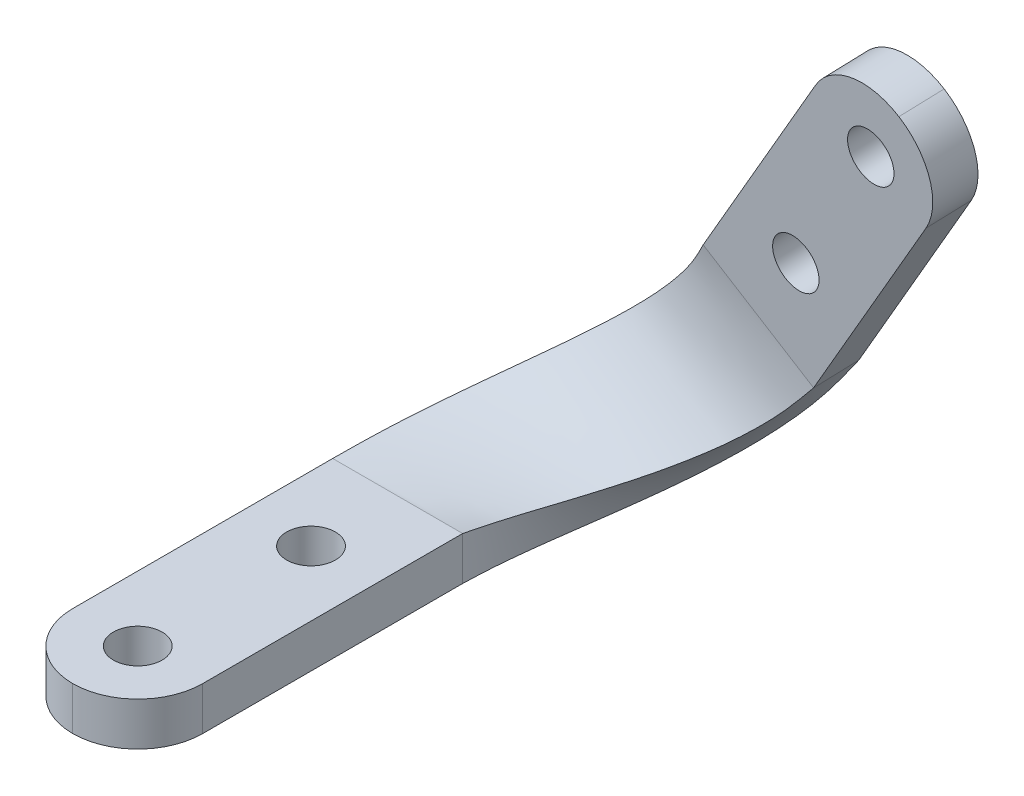
ISO-10303-21;
HEADER;
FILE_DESCRIPTION(('STEP AP214'),'2;1');
FILE_NAME('part.step','',(''),(''),'','','');
FILE_SCHEMA(('AUTOMOTIVE_DESIGN { 1 0 10303 214 1 1 1 1 }'));
ENDSEC;
DATA;
#1=APPLICATION_CONTEXT('core data for automotive mechanical design processes');
#2=APPLICATION_PROTOCOL_DEFINITION('international standard','automotive_design',2000,#1);
#3=PRODUCT_CONTEXT('',#1,'mechanical');
#4=PRODUCT('Part','Part','',(#3));
#5=PRODUCT_RELATED_PRODUCT_CATEGORY('part','',(#4));
#6=PRODUCT_DEFINITION_FORMATION('','',#4);
#7=PRODUCT_DEFINITION_CONTEXT('part definition',#1,'design');
#8=PRODUCT_DEFINITION('design','',#6,#7);
#9=PRODUCT_DEFINITION_SHAPE('','',#8);
#10=(LENGTH_UNIT() NAMED_UNIT(*) SI_UNIT(.MILLI.,.METRE.));
#11=(NAMED_UNIT(*) PLANE_ANGLE_UNIT() SI_UNIT($,.RADIAN.));
#12=(NAMED_UNIT(*) SI_UNIT($,.STERADIAN.) SOLID_ANGLE_UNIT());
#13=UNCERTAINTY_MEASURE_WITH_UNIT(LENGTH_MEASURE(1.E-05),#10,'distance_accuracy_value','');
#14=(GEOMETRIC_REPRESENTATION_CONTEXT(3) GLOBAL_UNCERTAINTY_ASSIGNED_CONTEXT((#13)) GLOBAL_UNIT_ASSIGNED_CONTEXT((#10,
#11,#12)) REPRESENTATION_CONTEXT('',''));
#15=CARTESIAN_POINT('',(0.,0.,0.));
#16=DIRECTION('',(0.,0.,1.));
#17=DIRECTION('',(1.,0.,0.));
#18=AXIS2_PLACEMENT_3D('',#15,#16,#17);
#19=CARTESIAN_POINT('',(87.6071870087429,121.992427648043,33.4995000851092));
#20=DIRECTION('',(-0.847822787226467,0.530276573500271,0.00181026416767009));
#21=DIRECTION('',(-0.530277442375515,-0.847824176411409,0.));
#22=AXIS2_PLACEMENT_3D('',#19,#20,#21);
#23=PLANE('',#22);
#24=DIRECTION('',(-0.528000453286406,-0.843857644069764,-0.0954976328208115));
#25=VECTOR('',#24,1.);
#26=CARTESIAN_POINT('',(87.6071870087429,121.992427648043,33.4995000851092));
#27=LINE('',#26,#25);
#28=CARTESIAN_POINT('',(54.0791582250561,68.4074672496127,27.4354004009877));
#29=VERTEX_POINT('',#28);
#30=CARTESIAN_POINT('',(33.9623409548441,36.2564910105547,23.7969405905148));
#31=VERTEX_POINT('',#30);
#32=EDGE_CURVE('E283',#29,#31,#27,.T.);
#33=ORIENTED_EDGE('',*,*,#32,.T.);
#34=CARTESIAN_POINT('',(34.2742056616566,36.7766886590877,17.4759727207099));
#35=CARTESIAN_POINT('',(33.9623409548441,36.2564910105547,23.7969405905148));
#36=B_SPLINE_CURVE_WITH_KNOTS('',1,(#34,#35),.UNSPECIFIED.,.F.,.F.,(2,2),(0.,1.),.UNSPECIFIED.);
#37=CARTESIAN_POINT('',(34.2742056616566,36.7766886590877,17.4759727207099));
#38=VERTEX_POINT('',#37);
#39=EDGE_CURVE('E337',#31,#38,#36,.F.);
#40=ORIENTED_EDGE('',*,*,#39,.T.);
#41=DIRECTION('',(-0.528000453286406,-0.843857644069764,-0.0954976328208115));
#42=VECTOR('',#41,1.);
#43=CARTESIAN_POINT('',(87.9190517155554,122.512625296576,27.1785322153044));
#44=LINE('',#43,#42);
#45=CARTESIAN_POINT('',(54.3910229318686,68.9276648981457,21.1144325311828));
#46=VERTEX_POINT('',#45);
#47=EDGE_CURVE('E407',#46,#38,#44,.T.);
#48=ORIENTED_EDGE('',*,*,#47,.F.);
#49=DIRECTION('',(0.049112552253933,0.0819208895327681,-0.995428010992892));
#50=VECTOR('',#49,1.);
#51=CARTESIAN_POINT('',(54.0791582250561,68.4074672496127,27.4354004009877));
#52=LINE('',#51,#50);
#53=EDGE_CURVE('E11',#29,#46,#52,.T.);
#54=ORIENTED_EDGE('',*,*,#53,.F.);
#55=EDGE_LOOP('',(#33,#40,#48,#54));
#56=FACE_BOUND('',#55,.T.);
#57=ADVANCED_FACE('F41',(#56),#23,.F.);
#58=CARTESIAN_POINT('',(-9.01110616876953,3.49029141699084,18.9801463756117));
#59=DIRECTION('',(0.847822787226467,-0.530276573500271,-0.00181026416767008));
#60=DIRECTION('',(0.530277442375514,0.847824176411408,0.));
#61=AXIS2_PLACEMENT_3D('',#58,#59,#60);
#62=PLANE('',#61);
#63=DIRECTION('',(0.528000453286406,0.843857644069764,0.0954976328208115));
#64=VECTOR('',#63,1.);
#65=CARTESIAN_POINT('',(-8.69924146195705,4.01048906552392,12.6591785058068));
#66=LINE('',#65,#64);
#67=CARTESIAN_POINT('',(18.1231815649923,46.8784573842679,17.510458253104));
#68=VERTEX_POINT('',#67);
#69=CARTESIAN_POINT('',(38.2399988352044,79.029433623326,21.148918063577));
#70=VERTEX_POINT('',#69);
#71=EDGE_CURVE('E290',#68,#70,#66,.T.);
#72=ORIENTED_EDGE('',*,*,#71,.F.);
#73=CARTESIAN_POINT('',(17.8113168581799,46.3582597357348,23.8314261229089));
#74=CARTESIAN_POINT('',(18.1231815649923,46.8784573842679,17.510458253104));
#75=B_SPLINE_CURVE_WITH_KNOTS('',1,(#73,#74),.UNSPECIFIED.,.F.,.F.,(2,2),(0.,1.),.UNSPECIFIED.);
#76=CARTESIAN_POINT('',(17.8113168581799,46.3582597357348,23.8314261229089));
#77=VERTEX_POINT('',#76);
#78=EDGE_CURVE('E434',#77,#68,#75,.T.);
#79=ORIENTED_EDGE('',*,*,#78,.F.);
#80=DIRECTION('',(0.528000453286406,0.843857644069764,0.0954976328208115));
#81=VECTOR('',#80,1.);
#82=CARTESIAN_POINT('',(-9.01110616876953,3.49029141699084,18.9801463756117));
#83=LINE('',#82,#81);
#84=CARTESIAN_POINT('',(37.928134128392,78.5092359747929,27.4698859333818));
#85=VERTEX_POINT('',#84);
#86=EDGE_CURVE('E301',#77,#85,#83,.T.);
#87=ORIENTED_EDGE('',*,*,#86,.T.);
#88=DIRECTION('',(0.049112552253933,0.0819208895327681,-0.995428010992892));
#89=VECTOR('',#88,1.);
#90=CARTESIAN_POINT('',(37.9281341283919,78.5092359747929,27.4698859333818));
#91=LINE('',#90,#89);
#92=EDGE_CURVE('E401',#70,#85,#91,.F.);
#93=ORIENTED_EDGE('',*,*,#92,.F.);
#94=EDGE_LOOP('',(#72,#79,#87,#93));
#95=FACE_BOUND('',#94,.T.);
#96=ADVANCED_FACE('F262',(#95),#62,.F.);
#97=CARTESIAN_POINT('',(-0.935594120437424,-1.56059294559923,18.9629036094146));
#98=DIRECTION('',(-0.049112552253933,-0.0819208895327681,0.995428010992892));
#99=DIRECTION('',(0.,0.996630694601877,0.0820198669675865));
#100=AXIS2_PLACEMENT_3D('',#97,#98,#99);
#101=PLANE('',#100);
#102=CARTESIAN_POINT('',(46.0036461767241,73.4583516122028,27.4526431671847));
#103=DIRECTION('',(0.049112552253933,0.0819208895327678,-0.995428010992892));
#104=DIRECTION('',(0.,0.996630694601877,0.0820198669675863));
#105=AXIS2_PLACEMENT_3D('',#102,#103,#104);
#106=CIRCLE('',#105,3.57124);
#107=CARTESIAN_POINT('',(46.0036461767241,77.0175590139928,27.7455557968941));
#108=VERTEX_POINT('',#107);
#109=EDGE_CURVE('E383',#108,#108,#106,.T.);
#110=ORIENTED_EDGE('',*,*,#109,.T.);
#111=EDGE_LOOP('',(#110));
#112=FACE_BOUND('',#111,.T.);
#113=CARTESIAN_POINT('',(32.5924346632494,52.0243674528308,25.0270032935361));
#114=DIRECTION('',(0.049112552253933,0.0819208895327678,-0.995428010992892));
#115=DIRECTION('',(0.,0.996630694601877,0.0820198669675863));
#116=AXIS2_PLACEMENT_3D('',#113,#114,#115);
#117=CIRCLE('',#116,3.57124);
#118=CARTESIAN_POINT('',(32.5924346632494,55.5835748546208,25.3199159232454));
#119=VERTEX_POINT('',#118);
#120=EDGE_CURVE('E393',#119,#119,#117,.T.);
#121=ORIENTED_EDGE('',*,*,#120,.T.);
#122=EDGE_LOOP('',(#121));
#123=FACE_BOUND('',#122,.T.);
#124=ORIENTED_EDGE('',*,*,#86,.F.);
#125=CARTESIAN_POINT('',(33.9623409548441,36.2564910105547,23.7969405905148));
#126=CARTESIAN_POINT('',(17.8113168581799,46.3582597357348,23.8314261229089));
#127=B_SPLINE_CURVE_WITH_KNOTS('',1,(#125,#126),.UNSPECIFIED.,.F.,.F.,(2,2),(0.,1.),.UNSPECIFIED.);
#128=EDGE_CURVE('E154',#31,#77,#127,.T.);
#129=ORIENTED_EDGE('',*,*,#128,.F.);
#130=ORIENTED_EDGE('',*,*,#32,.F.);
#131=CARTESIAN_POINT('',(46.003646176724,73.4583516122028,27.4526431671847));
#132=DIRECTION('',(0.049112552253933,0.0819208895327681,-0.995428010992892));
#133=DIRECTION('',(0.,0.996630694601877,0.0820198669675865));
#134=AXIS2_PLACEMENT_3D('',#131,#132,#133);
#135=CIRCLE('',#134,9.525);
#136=CARTESIAN_POINT('',(51.0328504942771,81.4960956719673,28.362258119803));
#137=VERTEX_POINT('',#136);
#138=EDGE_CURVE('E64',#137,#29,#135,.T.);
#139=ORIENTED_EDGE('',*,*,#138,.F.);
#140=CARTESIAN_POINT('',(46.003646176724,73.4583516122028,27.4526431671847));
#141=DIRECTION('',(0.049112552253933,0.0819208895327681,-0.995428010992892));
#142=DIRECTION('',(0.,0.996630694601877,0.0820198669675865));
#143=AXIS2_PLACEMENT_3D('',#140,#141,#142);
#144=CIRCLE('',#143,9.525);
#145=EDGE_CURVE('E52',#85,#137,#144,.T.);
#146=ORIENTED_EDGE('',*,*,#145,.F.);
#147=EDGE_LOOP('',(#124,#129,#130,#139,#146));
#148=FACE_BOUND('',#147,.T.);
#149=ADVANCED_FACE('F268',(#112,#123,#148),#101,.T.);
#150=CARTESIAN_POINT('',(-0.62372941362495,-1.04039529706616,12.6419357396097));
#151=DIRECTION('',(-0.049112552253933,-0.0819208895327681,0.995428010992892));
#152=DIRECTION('',(0.,0.996630694601877,0.0820198669675865));
#153=AXIS2_PLACEMENT_3D('',#150,#151,#152);
#154=PLANE('',#153);
#155=CARTESIAN_POINT('',(46.3155108835365,73.9785492607358,21.1316752973799));
#156=DIRECTION('',(0.049112552253933,0.0819208895327681,-0.995428010992892));
#157=DIRECTION('',(0.,0.996630694601877,0.0820198669675865));
#158=AXIS2_PLACEMENT_3D('',#155,#156,#157);
#159=CIRCLE('',#158,3.57124);
#160=CARTESIAN_POINT('',(46.3155108835365,77.5377566625259,21.4245879270892));
#161=VERTEX_POINT('',#160);
#162=EDGE_CURVE('E391',#161,#161,#159,.T.);
#163=ORIENTED_EDGE('',*,*,#162,.F.);
#164=EDGE_LOOP('',(#163));
#165=FACE_BOUND('',#164,.T.);
#166=CARTESIAN_POINT('',(32.9042993700618,52.5445651013639,18.7060354237313));
#167=DIRECTION('',(0.049112552253933,0.0819208895327681,-0.995428010992892));
#168=DIRECTION('',(0.,0.996630694601877,0.0820198669675865));
#169=AXIS2_PLACEMENT_3D('',#166,#167,#168);
#170=CIRCLE('',#169,3.57124);
#171=CARTESIAN_POINT('',(32.9042993700618,56.1037725031539,18.9989480534406));
#172=VERTEX_POINT('',#171);
#173=EDGE_CURVE('E396',#172,#172,#170,.T.);
#174=ORIENTED_EDGE('',*,*,#173,.F.);
#175=EDGE_LOOP('',(#174));
#176=FACE_BOUND('',#175,.T.);
#177=CARTESIAN_POINT('',(46.3155108835365,73.9785492607358,21.1316752973799));
#178=DIRECTION('',(0.049112552253933,0.0819208895327681,-0.995428010992892));
#179=DIRECTION('',(0.,0.996630694601877,0.0820198669675865));
#180=AXIS2_PLACEMENT_3D('',#177,#178,#179);
#181=CIRCLE('',#180,9.525);
#182=CARTESIAN_POINT('',(51.3447152010895,82.0162933205003,22.0412902499981));
#183=VERTEX_POINT('',#182);
#184=EDGE_CURVE('E397',#46,#183,#181,.F.);
#185=ORIENTED_EDGE('',*,*,#184,.F.);
#186=ORIENTED_EDGE('',*,*,#47,.T.);
#187=CARTESIAN_POINT('',(18.1231815649923,46.8784573842679,17.510458253104));
#188=CARTESIAN_POINT('',(34.2742056616566,36.7766886590877,17.4759727207099));
#189=B_SPLINE_CURVE_WITH_KNOTS('',1,(#187,#188),.UNSPECIFIED.,.F.,.F.,(2,2),(0.,1.),.UNSPECIFIED.);
#190=EDGE_CURVE('E413',#38,#68,#189,.F.);
#191=ORIENTED_EDGE('',*,*,#190,.T.);
#192=ORIENTED_EDGE('',*,*,#71,.T.);
#193=CARTESIAN_POINT('',(46.3155108835365,73.9785492607359,21.1316752973799));
#194=DIRECTION('',(0.049112552253933,0.0819208895327681,-0.995428010992892));
#195=DIRECTION('',(0.,0.996630694601877,0.0820198669675865));
#196=AXIS2_PLACEMENT_3D('',#193,#194,#195);
#197=CIRCLE('',#196,9.525);
#198=EDGE_CURVE('E399',#183,#70,#197,.F.);
#199=ORIENTED_EDGE('',*,*,#198,.F.);
#200=EDGE_LOOP('',(#185,#186,#191,#192,#199));
#201=FACE_BOUND('',#200,.T.);
#202=ADVANCED_FACE('F311',(#165,#176,#201),#154,.F.);
#203=CARTESIAN_POINT('',(46.003646176724,73.4583516122028,27.4526431671848));
#204=DIRECTION('',(0.049112552253933,0.0819208895327681,-0.995428010992892));
#205=DIRECTION('',(0.,-0.996630694601877,-0.0820198669675866));
#206=AXIS2_PLACEMENT_3D('',#203,#204,#205);
#207=CYLINDRICAL_SURFACE('',#206,9.525);
#208=ORIENTED_EDGE('',*,*,#53,.T.);
#209=ORIENTED_EDGE('',*,*,#184,.T.);
#210=DIRECTION('',(0.049112552253933,0.0819208895327681,-0.995428010992892));
#211=VECTOR('',#210,1.);
#212=CARTESIAN_POINT('',(51.0328504942771,81.4960956719673,28.362258119803));
#213=LINE('',#212,#211);
#214=EDGE_CURVE('E60',#183,#137,#213,.F.);
#215=ORIENTED_EDGE('',*,*,#214,.T.);
#216=ORIENTED_EDGE('',*,*,#138,.T.);
#217=EDGE_LOOP('',(#208,#209,#215,#216));
#218=FACE_BOUND('',#217,.T.);
#219=ADVANCED_FACE('F43',(#218),#207,.T.);
#220=CARTESIAN_POINT('',(46.003646176724,73.4583516122028,27.4526431671847));
#221=DIRECTION('',(0.049112552253933,0.0819208895327681,-0.995428010992892));
#222=DIRECTION('',(0.,-0.996630694601877,-0.0820198669675866));
#223=AXIS2_PLACEMENT_3D('',#220,#221,#222);
#224=CYLINDRICAL_SURFACE('',#223,9.525);
#225=ORIENTED_EDGE('',*,*,#145,.T.);
#226=ORIENTED_EDGE('',*,*,#214,.F.);
#227=ORIENTED_EDGE('',*,*,#198,.T.);
#228=ORIENTED_EDGE('',*,*,#92,.T.);
#229=EDGE_LOOP('',(#225,#226,#227,#228));
#230=FACE_BOUND('',#229,.T.);
#231=ADVANCED_FACE('F275',(#230),#224,.T.);
#232=CARTESIAN_POINT('',(32.5924346632494,52.0243674528308,25.0270032935361));
#233=DIRECTION('',(-0.049112552253933,-0.0819208895327678,0.995428010992892));
#234=DIRECTION('',(0.,0.996630694601877,0.0820198669675863));
#235=AXIS2_PLACEMENT_3D('',#232,#233,#234);
#236=CYLINDRICAL_SURFACE('',#235,3.57124);
#237=ORIENTED_EDGE('',*,*,#120,.F.);
#238=EDGE_LOOP('',(#237));
#239=FACE_BOUND('',#238,.T.);
#240=ORIENTED_EDGE('',*,*,#173,.T.);
#241=EDGE_LOOP('',(#240));
#242=FACE_BOUND('',#241,.T.);
#243=ADVANCED_FACE('F313',(#239,#242),#236,.F.);
#244=CARTESIAN_POINT('',(46.0036461767241,73.4583516122028,27.4526431671847));
#245=DIRECTION('',(-0.049112552253933,-0.0819208895327678,0.995428010992892));
#246=DIRECTION('',(0.,0.996630694601877,0.0820198669675863));
#247=AXIS2_PLACEMENT_3D('',#244,#245,#246);
#248=CYLINDRICAL_SURFACE('',#247,3.57124);
#249=ORIENTED_EDGE('',*,*,#109,.F.);
#250=EDGE_LOOP('',(#249));
#251=FACE_BOUND('',#250,.T.);
#252=ORIENTED_EDGE('',*,*,#162,.T.);
#253=EDGE_LOOP('',(#252));
#254=FACE_BOUND('',#253,.T.);
#255=ADVANCED_FACE('F367',(#251,#254),#248,.F.);
#256=CARTESIAN_POINT('',(9.525,19.05,50.8));
#257=CARTESIAN_POINT('',(9.55323490534045,18.7810964671223,49.3484918740891));
#258=CARTESIAN_POINT('',(9.58918036426722,18.4387591800032,47.5005973940943));
#259=CARTESIAN_POINT('',(10.0328090544816,18.1398501277308,44.6320621487925));
#260=CARTESIAN_POINT('',(10.5391948711751,18.0169665482934,42.4477501896126));
#261=CARTESIAN_POINT('',(11.3536399094085,18.0624849325356,40.1223104394735));
#262=CARTESIAN_POINT('',(12.4582845863289,18.3094298746793,37.6807000287129));
#263=CARTESIAN_POINT('',(13.58682832241,18.7180370599514,35.7699736375052));
#264=CARTESIAN_POINT('',(15.4428852518749,19.5637591969408,33.1681249147786));
#265=CARTESIAN_POINT('',(16.9583326065604,20.3896028304851,31.4769695378744));
#266=CARTESIAN_POINT('',(19.7888763058083,22.2371131948377,28.9596885485364));
#267=CARTESIAN_POINT('',(21.6729610372838,23.628739663378,27.6358908288917));
#268=CARTESIAN_POINT('',(25.0111510039676,26.4308924237617,25.8089450363039));
#269=CARTESIAN_POINT('',(26.9679681400184,28.2725375704808,25.0284736383239));
#270=CARTESIAN_POINT('',(30.477687315586,31.957798356211,24.0721847032252));
#271=CARTESIAN_POINT('',(32.2605936713705,34.1572038777954,23.9313573703692));
#272=CARTESIAN_POINT('',(33.9623409548441,36.2564910105547,23.7969405905148));
#273=CARTESIAN_POINT('',(-9.525,19.05,50.8));
#274=CARTESIAN_POINT('',(-9.22882209703576,19.3217070874686,48.4457237382647));
#275=CARTESIAN_POINT('',(-8.85176219484571,19.6676135403131,45.4485279039575));
#276=CARTESIAN_POINT('',(-7.65171281405978,20.5790063367583,41.0175750068454));
#277=CARTESIAN_POINT('',(-6.47812330838176,21.4519245995127,37.7360038547512));
#278=CARTESIAN_POINT('',(-4.79837008376615,22.7005734521186,34.3829451599599));
#279=CARTESIAN_POINT('',(-2.80421529167914,24.2168746664327,31.2360318216372));
#280=CARTESIAN_POINT('',(-1.02297411971369,25.6255092406382,29.1004402789216));
#281=CARTESIAN_POINT('',(1.63088299562274,27.8179651343383,26.4994823815697));
#282=CARTESIAN_POINT('',(3.56019969326495,29.5052015380714,25.1145110160508));
#283=CARTESIAN_POINT('',(6.69107421108755,32.4520257355951,23.4630072709389));
#284=CARTESIAN_POINT('',(8.53821200223575,34.3247347058712,22.8579027012054));
#285=CARTESIAN_POINT('',(11.4647671577939,37.5520270040652,22.3539636434163));
#286=CARTESIAN_POINT('',(12.9938846543369,39.4089354743332,22.3802507945236));
#287=CARTESIAN_POINT('',(15.55991310883,42.8307509725846,22.80939052825));
#288=CARTESIAN_POINT('',(16.7118330611979,44.6355839473893,23.332310148446));
#289=CARTESIAN_POINT('',(17.8113168581799,46.3582597357348,23.8314261229089));
#290=B_SPLINE_SURFACE_WITH_KNOTS('',1,3,((#256,#257,#258,#259,#260,#261,#262,#263,#264,#265,
#266,#267,#268,#269,#270,#271,#272),(#273,#274,#275,#276,#277,#278,#279,#280,#281,#282,#283,
#284,#285,#286,#287,#288,#289)),.UNSPECIFIED.,.F.,.F.,.F.,(2,2),(4,1,1,1,1,1,1,1,1,1,1,1,1,1,4),
(0.,1.),(0.,0.110077316906559,0.14013787635988,0.220163588132605,0.280213406106561,
0.3302626192913,0.420266034132632,0.440289977770212,0.560123609538524,0.580132981303769,
0.706724079897994,0.720083367225856,0.85332831952135,0.860004911078336,1.),.UNSPECIFIED.);
#291=CARTESIAN_POINT('',(-9.525,19.05,50.8));
#292=CARTESIAN_POINT('',(9.525,19.05,50.8));
#293=B_SPLINE_CURVE_WITH_KNOTS('',1,(#291,#292),.UNSPECIFIED.,.F.,.F.,(2,2),(0.,1.),.UNSPECIFIED.);
#294=CARTESIAN_POINT('',(9.525,19.05,50.8));
#295=VERTEX_POINT('',#294);
#296=CARTESIAN_POINT('',(-9.525,19.05,50.8));
#297=VERTEX_POINT('',#296);
#298=EDGE_CURVE('E146',#295,#297,#293,.F.);
#299=CARTESIAN_POINT('',(9.525,19.05,50.8));
#300=CARTESIAN_POINT('',(9.55323490534045,18.7810964671223,49.3484918740891));
#301=CARTESIAN_POINT('',(9.58918036426722,18.4387591800032,47.5005973940943));
#302=CARTESIAN_POINT('',(10.0328090544816,18.1398501277308,44.6320621487925));
#303=CARTESIAN_POINT('',(10.5391948711751,18.0169665482934,42.4477501896126));
#304=CARTESIAN_POINT('',(11.3536399094085,18.0624849325356,40.1223104394735));
#305=CARTESIAN_POINT('',(12.4582845863289,18.3094298746793,37.6807000287129));
#306=CARTESIAN_POINT('',(13.58682832241,18.7180370599514,35.7699736375052));
#307=CARTESIAN_POINT('',(15.4428852518749,19.5637591969408,33.1681249147786));
#308=CARTESIAN_POINT('',(16.9583326065604,20.3896028304851,31.4769695378744));
#309=CARTESIAN_POINT('',(19.7888763058083,22.2371131948377,28.9596885485364));
#310=CARTESIAN_POINT('',(21.6729610372838,23.628739663378,27.6358908288917));
#311=CARTESIAN_POINT('',(25.0111510039676,26.4308924237617,25.8089450363039));
#312=CARTESIAN_POINT('',(26.9679681400184,28.2725375704808,25.0284736383239));
#313=CARTESIAN_POINT('',(30.477687315586,31.957798356211,24.0721847032252));
#314=CARTESIAN_POINT('',(32.2605936713705,34.1572038777954,23.9313573703692));
#315=CARTESIAN_POINT('',(33.9623409548441,36.2564910105547,23.7969405905148));
#316=B_SPLINE_CURVE_WITH_KNOTS('',3,(#299,#300,#301,#302,#303,#304,#305,#306,#307,#308,#309,
#310,#311,#312,#313,#314,#315),.UNSPECIFIED.,.F.,.F.,(4,1,1,1,1,1,1,1,1,1,1,1,1,1,4),(0.,
0.110077316906559,0.14013787635988,0.220163588132605,0.280213406106561,0.3302626192913,
0.420266034132632,0.440289977770212,0.560123609538524,0.580132981303769,0.706724079897994,
0.720083367225856,0.85332831952135,0.860004911078336,1.),.UNSPECIFIED.);
#317=EDGE_CURVE('E145',#31,#295,#316,.F.);
#318=CARTESIAN_POINT('',(-9.525,19.05,50.8));
#319=CARTESIAN_POINT('',(-9.22882209703576,19.3217070874686,48.4457237382647));
#320=CARTESIAN_POINT('',(-8.85176219484571,19.6676135403131,45.4485279039575));
#321=CARTESIAN_POINT('',(-7.65171281405978,20.5790063367583,41.0175750068454));
#322=CARTESIAN_POINT('',(-6.47812330838176,21.4519245995127,37.7360038547512));
#323=CARTESIAN_POINT('',(-4.79837008376615,22.7005734521186,34.3829451599599));
#324=CARTESIAN_POINT('',(-2.80421529167914,24.2168746664327,31.2360318216372));
#325=CARTESIAN_POINT('',(-1.02297411971369,25.6255092406382,29.1004402789216));
#326=CARTESIAN_POINT('',(1.63088299562274,27.8179651343383,26.4994823815697));
#327=CARTESIAN_POINT('',(3.56019969326495,29.5052015380714,25.1145110160508));
#328=CARTESIAN_POINT('',(6.69107421108755,32.4520257355951,23.4630072709389));
#329=CARTESIAN_POINT('',(8.53821200223575,34.3247347058712,22.8579027012054));
#330=CARTESIAN_POINT('',(11.4647671577939,37.5520270040652,22.3539636434163));
#331=CARTESIAN_POINT('',(12.9938846543369,39.4089354743332,22.3802507945236));
#332=CARTESIAN_POINT('',(15.55991310883,42.8307509725846,22.80939052825));
#333=CARTESIAN_POINT('',(16.7118330611979,44.6355839473893,23.332310148446));
#334=CARTESIAN_POINT('',(17.8113168581799,46.3582597357348,23.8314261229089));
#335=B_SPLINE_CURVE_WITH_KNOTS('',3,(#318,#319,#320,#321,#322,#323,#324,#325,#326,#327,#328,
#329,#330,#331,#332,#333,#334),.UNSPECIFIED.,.F.,.F.,(4,1,1,1,1,1,1,1,1,1,1,1,1,1,4),(0.,
0.110077316906559,0.14013787635988,0.220163588132605,0.280213406106561,0.3302626192913,
0.420266034132632,0.440289977770212,0.560123609538524,0.580132981303769,0.706724079897994,
0.720083367225856,0.85332831952135,0.860004911078336,1.),.UNSPECIFIED.);
#336=EDGE_CURVE('E142',#297,#77,#335,.T.);
#337=ORIENTED_EDGE('',*,*,#298,.F.);
#338=ORIENTED_EDGE('',*,*,#317,.F.);
#339=ORIENTED_EDGE('',*,*,#128,.T.);
#340=ORIENTED_EDGE('',*,*,#336,.F.);
#341=EDGE_LOOP('',(#337,#338,#339,#340));
#342=FACE_BOUND('',#341,.T.);
#343=ADVANCED_FACE('F151',(#342),#290,.F.);
#344=CARTESIAN_POINT('',(-9.525,19.05,50.8));
#345=CARTESIAN_POINT('',(-9.22882209703577,19.3217070874686,48.4457237382647));
#346=CARTESIAN_POINT('',(-8.85176219484572,19.6676135403131,45.4485279039575));
#347=CARTESIAN_POINT('',(-7.65171281405976,20.5790063367583,41.0175750068454));
#348=CARTESIAN_POINT('',(-6.47812330838177,21.4519245995127,37.7360038547512));
#349=CARTESIAN_POINT('',(-4.79837008376614,22.7005734521186,34.3829451599599));
#350=CARTESIAN_POINT('',(-2.80421529167914,24.2168746664327,31.2360318216372));
#351=CARTESIAN_POINT('',(-1.02297411971368,25.6255092406382,29.1004402789216));
#352=CARTESIAN_POINT('',(1.63088299562273,27.8179651343383,26.4994823815697));
#353=CARTESIAN_POINT('',(3.56019969326494,29.5052015380714,25.1145110160508));
#354=CARTESIAN_POINT('',(6.69107421108756,32.4520257355951,23.4630072709389));
#355=CARTESIAN_POINT('',(8.53821200223574,34.3247347058712,22.8579027012054));
#356=CARTESIAN_POINT('',(11.4647671577939,37.5520270040652,22.3539636434163));
#357=CARTESIAN_POINT('',(12.9938846543369,39.4089354743332,22.3802507945236));
#358=CARTESIAN_POINT('',(15.55991310883,42.8307509725846,22.80939052825));
#359=CARTESIAN_POINT('',(16.7118330611979,44.6355839473893,23.332310148446));
#360=CARTESIAN_POINT('',(17.8113168581799,46.3582597357348,23.8314261229089));
#361=CARTESIAN_POINT('',(-9.525,12.7,50.8));
#362=CARTESIAN_POINT('',(-9.39621490016765,13.0520781844423,48.2595437135402));
#363=CARTESIAN_POINT('',(-9.23226040977412,13.5003039449072,45.0253247211587));
#364=CARTESIAN_POINT('',(-8.2921207934219,14.6158873388332,40.0816298570712));
#365=CARTESIAN_POINT('',(-7.28033811746426,15.673239616937,36.3484689384421));
#366=CARTESIAN_POINT('',(-5.68870338472228,17.1916517433343,32.4002257987371));
#367=CARTESIAN_POINT('',(-3.72073121285139,19.0435590475994,28.6169613145994));
#368=CARTESIAN_POINT('',(-1.89913966313145,20.7763629646389,25.9734171349271));
#369=CARTESIAN_POINT('',(0.884415603110571,23.5027534987058,22.6642706391077));
#370=CARTESIAN_POINT('',(2.97075663112067,25.6393948252214,20.8017994615024));
#371=CARTESIAN_POINT('',(6.36084212419886,29.3677413715521,18.5011475503637));
#372=CARTESIAN_POINT('',(8.36278590371618,31.7426257709854,17.5748524546547));
#373=CARTESIAN_POINT('',(11.5340552381463,35.8504013418275,16.6296671394444));
#374=CARTESIAN_POINT('',(13.1716726044474,38.2123042915669,16.4711244987661));
#375=CARTESIAN_POINT('',(15.8595307329441,42.5086877860025,16.64627900321));
#376=CARTESIAN_POINT('',(17.0177168465559,44.7444594857459,17.0884321801614));
#377=CARTESIAN_POINT('',(18.1231815649923,46.8784573842679,17.510458253104));
#378=B_SPLINE_SURFACE_WITH_KNOTS('',1,3,((#344,#345,#346,#347,#348,#349,#350,#351,#352,#353,
#354,#355,#356,#357,#358,#359,#360),(#361,#362,#363,#364,#365,#366,#367,#368,#369,#370,#371,
#372,#373,#374,#375,#376,#377)),.UNSPECIFIED.,.F.,.F.,.F.,(2,2),(4,1,1,1,1,1,1,1,1,1,1,1,1,1,4),
(0.,1.),(0.,0.110077316906559,0.14013787635988,0.220163588132605,0.280213406106561,
0.3302626192913,0.420266034132632,0.440289977770212,0.560123609538524,0.580132981303769,
0.706724079897994,0.720083367225856,0.85332831952135,0.860004911078336,1.),.UNSPECIFIED.);
#379=CARTESIAN_POINT('',(-9.525,12.7,50.8));
#380=CARTESIAN_POINT('',(-9.525,19.05,50.8));
#381=B_SPLINE_CURVE_WITH_KNOTS('',1,(#379,#380),.UNSPECIFIED.,.F.,.F.,(2,2),(0.,1.),.UNSPECIFIED.);
#382=CARTESIAN_POINT('',(-9.525,12.7,50.8));
#383=VERTEX_POINT('',#382);
#384=EDGE_CURVE('E126',#297,#383,#381,.F.);
#385=CARTESIAN_POINT('',(-9.525,12.7,50.8));
#386=CARTESIAN_POINT('',(-9.39621490016765,13.0520781844423,48.2595437135402));
#387=CARTESIAN_POINT('',(-9.23226040977412,13.5003039449072,45.0253247211587));
#388=CARTESIAN_POINT('',(-8.2921207934219,14.6158873388332,40.0816298570712));
#389=CARTESIAN_POINT('',(-7.28033811746426,15.673239616937,36.3484689384421));
#390=CARTESIAN_POINT('',(-5.68870338472228,17.1916517433343,32.4002257987371));
#391=CARTESIAN_POINT('',(-3.72073121285139,19.0435590475994,28.6169613145994));
#392=CARTESIAN_POINT('',(-1.89913966313145,20.7763629646389,25.9734171349271));
#393=CARTESIAN_POINT('',(0.884415603110571,23.5027534987058,22.6642706391077));
#394=CARTESIAN_POINT('',(2.97075663112067,25.6393948252214,20.8017994615024));
#395=CARTESIAN_POINT('',(6.36084212419886,29.3677413715521,18.5011475503637));
#396=CARTESIAN_POINT('',(8.36278590371618,31.7426257709854,17.5748524546547));
#397=CARTESIAN_POINT('',(11.5340552381463,35.8504013418275,16.6296671394444));
#398=CARTESIAN_POINT('',(13.1716726044474,38.2123042915669,16.4711244987661));
#399=CARTESIAN_POINT('',(15.8595307329441,42.5086877860025,16.64627900321));
#400=CARTESIAN_POINT('',(17.0177168465559,44.7444594857459,17.0884321801614));
#401=CARTESIAN_POINT('',(18.1231815649923,46.8784573842679,17.510458253104));
#402=B_SPLINE_CURVE_WITH_KNOTS('',3,(#385,#386,#387,#388,#389,#390,#391,#392,#393,#394,#395,
#396,#397,#398,#399,#400,#401),.UNSPECIFIED.,.F.,.F.,(4,1,1,1,1,1,1,1,1,1,1,1,1,1,4),(0.,
0.110077316906559,0.14013787635988,0.220163588132605,0.280213406106561,0.3302626192913,
0.420266034132632,0.440289977770212,0.560123609538524,0.580132981303769,0.706724079897994,
0.720083367225856,0.85332831952135,0.860004911078336,1.),.UNSPECIFIED.);
#403=EDGE_CURVE('E144',#383,#68,#402,.T.);
#404=ORIENTED_EDGE('',*,*,#384,.F.);
#405=ORIENTED_EDGE('',*,*,#336,.T.);
#406=ORIENTED_EDGE('',*,*,#78,.T.);
#407=ORIENTED_EDGE('',*,*,#403,.F.);
#408=EDGE_LOOP('',(#404,#405,#406,#407));
#409=FACE_BOUND('',#408,.T.);
#410=ADVANCED_FACE('F140',(#409),#378,.F.);
#411=CARTESIAN_POINT('',(9.525,12.7,50.8));
#412=CARTESIAN_POINT('',(9.38584210220858,12.511467564096,49.1623118493645));
#413=CARTESIAN_POINT('',(9.20868214933882,12.2714495845973,47.0773942112955));
#414=CARTESIAN_POINT('',(9.3924010751195,12.1767311298057,43.6961169990183));
#415=CARTESIAN_POINT('',(9.73698006209255,12.2382815657177,41.0602152733034));
#416=CARTESIAN_POINT('',(10.4633066084523,12.5535632237513,38.1395910782507));
#417=CARTESIAN_POINT('',(11.5417686651567,13.136114255846,35.0616295216751));
#418=CARTESIAN_POINT('',(12.7106627789923,13.868890783952,32.6429504935108));
#419=CARTESIAN_POINT('',(14.6964178593628,15.2485475613083,29.3329131723166));
#420=CARTESIAN_POINT('',(16.3688895444161,16.5237961176351,27.1642579833259));
#421=CARTESIAN_POINT('',(19.4586442189195,19.1528288307946,23.9978288279612));
#422=CARTESIAN_POINT('',(21.4975349387642,21.0466307284921,22.352840582341));
#423=CARTESIAN_POINT('',(25.08043908432,24.729266761524,20.084648532332));
#424=CARTESIAN_POINT('',(27.1457560901288,27.0759063877146,19.1193473425665));
#425=CARTESIAN_POINT('',(30.7773049397001,31.6357351696288,17.9090731781852));
#426=CARTESIAN_POINT('',(32.5664774567285,34.266079416152,17.6874794020846));
#427=CARTESIAN_POINT('',(34.2742056616566,36.7766886590877,17.4759727207099));
#428=CARTESIAN_POINT('',(9.525,19.05,50.8));
#429=CARTESIAN_POINT('',(9.55323490534045,18.7810964671223,49.3484918740891));
#430=CARTESIAN_POINT('',(9.58918036426722,18.4387591800032,47.5005973940943));
#431=CARTESIAN_POINT('',(10.0328090544816,18.1398501277308,44.6320621487925));
#432=CARTESIAN_POINT('',(10.5391948711751,18.0169665482934,42.4477501896126));
#433=CARTESIAN_POINT('',(11.3536399094085,18.0624849325356,40.1223104394735));
#434=CARTESIAN_POINT('',(12.4582845863289,18.3094298746793,37.6807000287129));
#435=CARTESIAN_POINT('',(13.58682832241,18.7180370599514,35.7699736375052));
#436=CARTESIAN_POINT('',(15.4428852518749,19.5637591969408,33.1681249147786));
#437=CARTESIAN_POINT('',(16.9583326065604,20.3896028304851,31.4769695378744));
#438=CARTESIAN_POINT('',(19.7888763058083,22.2371131948377,28.9596885485364));
#439=CARTESIAN_POINT('',(21.6729610372838,23.628739663378,27.6358908288917));
#440=CARTESIAN_POINT('',(25.0111510039676,26.4308924237617,25.8089450363039));
#441=CARTESIAN_POINT('',(26.9679681400184,28.2725375704808,25.0284736383239));
#442=CARTESIAN_POINT('',(30.477687315586,31.957798356211,24.0721847032253));
#443=CARTESIAN_POINT('',(32.2605936713705,34.1572038777954,23.9313573703692));
#444=CARTESIAN_POINT('',(33.9623409548441,36.2564910105547,23.7969405905148));
#445=B_SPLINE_SURFACE_WITH_KNOTS('',1,3,((#411,#412,#413,#414,#415,#416,#417,#418,#419,#420,
#421,#422,#423,#424,#425,#426,#427),(#428,#429,#430,#431,#432,#433,#434,#435,#436,#437,#438,
#439,#440,#441,#442,#443,#444)),.UNSPECIFIED.,.F.,.F.,.F.,(2,2),(4,1,1,1,1,1,1,1,1,1,1,1,1,1,4),
(0.,1.),(0.,0.110077316906559,0.14013787635988,0.220163588132605,0.280213406106561,
0.3302626192913,0.420266034132632,0.440289977770212,0.560123609538524,0.580132981303769,
0.706724079897994,0.720083367225856,0.85332831952135,0.860004911078336,1.),.UNSPECIFIED.);
#446=CARTESIAN_POINT('',(9.525,19.05,50.8));
#447=CARTESIAN_POINT('',(9.525,12.7,50.8));
#448=B_SPLINE_CURVE_WITH_KNOTS('',1,(#446,#447),.UNSPECIFIED.,.F.,.F.,(2,2),(0.,1.),.UNSPECIFIED.);
#449=CARTESIAN_POINT('',(9.525,12.7,50.8));
#450=VERTEX_POINT('',#449);
#451=EDGE_CURVE('E161',#450,#295,#448,.F.);
#452=CARTESIAN_POINT('',(9.525,12.7,50.8));
#453=CARTESIAN_POINT('',(9.38584210220857,12.511467564096,49.1623118493645));
#454=CARTESIAN_POINT('',(9.20868214933881,12.2714495845973,47.0773942112955));
#455=CARTESIAN_POINT('',(9.39240107511952,12.1767311298057,43.6961169990183));
#456=CARTESIAN_POINT('',(9.73698006209254,12.2382815657177,41.0602152733034));
#457=CARTESIAN_POINT('',(10.4633066084523,12.5535632237513,38.1395910782507));
#458=CARTESIAN_POINT('',(11.5417686651567,13.136114255846,35.0616295216751));
#459=CARTESIAN_POINT('',(12.7106627789923,13.868890783952,32.6429504935108));
#460=CARTESIAN_POINT('',(14.6964178593628,15.2485475613083,29.3329131723166));
#461=CARTESIAN_POINT('',(16.3688895444161,16.5237961176351,27.1642579833259));
#462=CARTESIAN_POINT('',(19.4586442189196,19.1528288307946,23.9978288279612));
#463=CARTESIAN_POINT('',(21.4975349387641,21.0466307284922,22.352840582341));
#464=CARTESIAN_POINT('',(25.0804390843201,24.729266761524,20.0846485323321));
#465=CARTESIAN_POINT('',(27.1457560901288,27.0759063877146,19.1193473425665));
#466=CARTESIAN_POINT('',(30.7773049397001,31.6357351696287,17.9090731781852));
#467=CARTESIAN_POINT('',(32.5664774567285,34.266079416152,17.6874794020846));
#468=CARTESIAN_POINT('',(34.2742056616566,36.7766886590877,17.4759727207099));
#469=B_SPLINE_CURVE_WITH_KNOTS('',3,(#452,#453,#454,#455,#456,#457,#458,#459,#460,#461,#462,
#463,#464,#465,#466,#467,#468),.UNSPECIFIED.,.F.,.F.,(4,1,1,1,1,1,1,1,1,1,1,1,1,1,4),(0.,
0.110077316906559,0.14013787635988,0.220163588132605,0.280213406106561,0.3302626192913,
0.420266034132632,0.440289977770212,0.560123609538524,0.580132981303769,0.706724079897994,
0.720083367225856,0.85332831952135,0.860004911078336,1.),.UNSPECIFIED.);
#470=EDGE_CURVE('E392',#450,#38,#469,.T.);
#471=ORIENTED_EDGE('',*,*,#451,.F.);
#472=ORIENTED_EDGE('',*,*,#470,.T.);
#473=ORIENTED_EDGE('',*,*,#39,.F.);
#474=ORIENTED_EDGE('',*,*,#317,.T.);
#475=EDGE_LOOP('',(#471,#472,#473,#474));
#476=FACE_BOUND('',#475,.T.);
#477=ADVANCED_FACE('F336',(#476),#445,.F.);
#478=CARTESIAN_POINT('',(-9.525,12.7,50.8));
#479=CARTESIAN_POINT('',(-9.39621490016765,13.0520781844423,48.2595437135402));
#480=CARTESIAN_POINT('',(-9.23226040977412,13.5003039449072,45.0253247211587));
#481=CARTESIAN_POINT('',(-8.2921207934219,14.6158873388332,40.0816298570712));
#482=CARTESIAN_POINT('',(-7.28033811746426,15.673239616937,36.3484689384421));
#483=CARTESIAN_POINT('',(-5.68870338472228,17.1916517433343,32.4002257987371));
#484=CARTESIAN_POINT('',(-3.72073121285139,19.0435590475994,28.6169613145994));
#485=CARTESIAN_POINT('',(-1.89913966313145,20.7763629646389,25.9734171349271));
#486=CARTESIAN_POINT('',(0.88441560311057,23.5027534987058,22.6642706391077));
#487=CARTESIAN_POINT('',(2.97075663112067,25.6393948252214,20.8017994615024));
#488=CARTESIAN_POINT('',(6.36084212419886,29.3677413715521,18.5011475503637));
#489=CARTESIAN_POINT('',(8.36278590371618,31.7426257709854,17.5748524546547));
#490=CARTESIAN_POINT('',(11.5340552381463,35.8504013418275,16.6296671394444));
#491=CARTESIAN_POINT('',(13.1716726044474,38.2123042915669,16.4711244987661));
#492=CARTESIAN_POINT('',(15.8595307329441,42.5086877860025,16.64627900321));
#493=CARTESIAN_POINT('',(17.0177168465559,44.7444594857459,17.0884321801614));
#494=CARTESIAN_POINT('',(18.1231815649923,46.8784573842679,17.510458253104));
#495=CARTESIAN_POINT('',(9.525,12.7,50.8));
#496=CARTESIAN_POINT('',(9.38584210220857,12.511467564096,49.1623118493645));
#497=CARTESIAN_POINT('',(9.20868214933881,12.2714495845973,47.0773942112955));
#498=CARTESIAN_POINT('',(9.39240107511952,12.1767311298057,43.6961169990183));
#499=CARTESIAN_POINT('',(9.73698006209254,12.2382815657177,41.0602152733034));
#500=CARTESIAN_POINT('',(10.4633066084523,12.5535632237513,38.1395910782507));
#501=CARTESIAN_POINT('',(11.5417686651567,13.136114255846,35.0616295216751));
#502=CARTESIAN_POINT('',(12.7106627789923,13.868890783952,32.6429504935108));
#503=CARTESIAN_POINT('',(14.6964178593628,15.2485475613083,29.3329131723166));
#504=CARTESIAN_POINT('',(16.3688895444161,16.5237961176351,27.1642579833259));
#505=CARTESIAN_POINT('',(19.4586442189196,19.1528288307946,23.9978288279612));
#506=CARTESIAN_POINT('',(21.4975349387641,21.0466307284922,22.352840582341));
#507=CARTESIAN_POINT('',(25.0804390843201,24.729266761524,20.0846485323321));
#508=CARTESIAN_POINT('',(27.1457560901288,27.0759063877146,19.1193473425665));
#509=CARTESIAN_POINT('',(30.7773049397001,31.6357351696287,17.9090731781852));
#510=CARTESIAN_POINT('',(32.5664774567285,34.266079416152,17.6874794020846));
#511=CARTESIAN_POINT('',(34.2742056616566,36.7766886590877,17.4759727207099));
#512=B_SPLINE_SURFACE_WITH_KNOTS('',1,3,((#478,#479,#480,#481,#482,#483,#484,#485,#486,#487,
#488,#489,#490,#491,#492,#493,#494),(#495,#496,#497,#498,#499,#500,#501,#502,#503,#504,#505,
#506,#507,#508,#509,#510,#511)),.UNSPECIFIED.,.F.,.F.,.F.,(2,2),(4,1,1,1,1,1,1,1,1,1,1,1,1,1,4),
(0.,1.),(0.,0.110077316906559,0.14013787635988,0.220163588132605,0.280213406106561,
0.3302626192913,0.420266034132632,0.440289977770212,0.560123609538524,0.580132981303769,
0.706724079897994,0.720083367225856,0.85332831952135,0.860004911078336,1.),.UNSPECIFIED.);
#513=CARTESIAN_POINT('',(9.525,12.7,50.8));
#514=CARTESIAN_POINT('',(-9.525,12.7,50.8));
#515=B_SPLINE_CURVE_WITH_KNOTS('',1,(#513,#514),.UNSPECIFIED.,.F.,.F.,(2,2),(0.,1.),.UNSPECIFIED.);
#516=EDGE_CURVE('E208',#383,#450,#515,.F.);
#517=ORIENTED_EDGE('',*,*,#516,.F.);
#518=ORIENTED_EDGE('',*,*,#403,.T.);
#519=ORIENTED_EDGE('',*,*,#190,.F.);
#520=ORIENTED_EDGE('',*,*,#470,.F.);
#521=EDGE_LOOP('',(#517,#518,#519,#520));
#522=FACE_BOUND('',#521,.T.);
#523=ADVANCED_FACE('F179',(#522),#512,.F.);
#524=CARTESIAN_POINT('',(-9.525,19.05,152.4));
#525=DIRECTION('',(1.,0.,0.));
#526=DIRECTION('',(0.,0.,1.));
#527=AXIS2_PLACEMENT_3D('',#524,#525,#526);
#528=PLANE('',#527);
#529=DIRECTION('',(0.,0.,-1.));
#530=VECTOR('',#529,1.);
#531=CARTESIAN_POINT('',(-9.525,19.05,152.4));
#532=LINE('',#531,#530);
#533=CARTESIAN_POINT('',(-9.525,19.05,88.9));
#534=VERTEX_POINT('',#533);
#535=EDGE_CURVE('E122',#534,#297,#532,.T.);
#536=ORIENTED_EDGE('',*,*,#535,.T.);
#537=ORIENTED_EDGE('',*,*,#384,.T.);
#538=DIRECTION('',(0.,0.,-1.));
#539=VECTOR('',#538,1.);
#540=CARTESIAN_POINT('',(-9.525,12.7,152.4));
#541=LINE('',#540,#539);
#542=CARTESIAN_POINT('',(-9.525,12.7,88.9));
#543=VERTEX_POINT('',#542);
#544=EDGE_CURVE('E201',#543,#383,#541,.T.);
#545=ORIENTED_EDGE('',*,*,#544,.F.);
#546=DIRECTION('',(0.,-1.,0.));
#547=VECTOR('',#546,1.);
#548=CARTESIAN_POINT('',(-9.525,19.05,88.9));
#549=LINE('',#548,#547);
#550=EDGE_CURVE('E129',#534,#543,#549,.T.);
#551=ORIENTED_EDGE('',*,*,#550,.F.);
#552=EDGE_LOOP('',(#536,#537,#545,#551));
#553=FACE_BOUND('',#552,.T.);
#554=ADVANCED_FACE('F124',(#553),#528,.F.);
#555=CARTESIAN_POINT('',(9.525,19.05,0.));
#556=DIRECTION('',(-1.,0.,0.));
#557=DIRECTION('',(0.,0.,-1.));
#558=AXIS2_PLACEMENT_3D('',#555,#556,#557);
#559=PLANE('',#558);
#560=DIRECTION('',(0.,0.,1.));
#561=VECTOR('',#560,1.);
#562=CARTESIAN_POINT('',(9.525,12.7,0.));
#563=LINE('',#562,#561);
#564=CARTESIAN_POINT('',(9.525,12.7,88.9));
#565=VERTEX_POINT('',#564);
#566=EDGE_CURVE('E134',#450,#565,#563,.T.);
#567=ORIENTED_EDGE('',*,*,#566,.F.);
#568=ORIENTED_EDGE('',*,*,#451,.T.);
#569=DIRECTION('',(0.,0.,1.));
#570=VECTOR('',#569,1.);
#571=CARTESIAN_POINT('',(9.525,19.05,0.));
#572=LINE('',#571,#570);
#573=CARTESIAN_POINT('',(9.525,19.05,88.9));
#574=VERTEX_POINT('',#573);
#575=EDGE_CURVE('E133',#295,#574,#572,.T.);
#576=ORIENTED_EDGE('',*,*,#575,.T.);
#577=DIRECTION('',(0.,-1.,0.));
#578=VECTOR('',#577,1.);
#579=CARTESIAN_POINT('',(9.525,19.05,88.9));
#580=LINE('',#579,#578);
#581=EDGE_CURVE('E228',#565,#574,#580,.F.);
#582=ORIENTED_EDGE('',*,*,#581,.F.);
#583=EDGE_LOOP('',(#567,#568,#576,#582));
#584=FACE_BOUND('',#583,.T.);
#585=ADVANCED_FACE('F178',(#584),#559,.F.);
#586=CARTESIAN_POINT('',(0.,19.05,0.));
#587=DIRECTION('',(0.,1.,0.));
#588=DIRECTION('',(0.,0.,-1.));
#589=AXIS2_PLACEMENT_3D('',#586,#587,#588);
#590=PLANE('',#589);
#591=CARTESIAN_POINT('',(0.,19.05,88.9));
#592=DIRECTION('',(0.,-1.,0.));
#593=DIRECTION('',(0.,0.,-1.));
#594=AXIS2_PLACEMENT_3D('',#591,#592,#593);
#595=CIRCLE('',#594,3.57123999999999);
#596=CARTESIAN_POINT('',(0.,19.05,85.32876));
#597=VERTEX_POINT('',#596);
#598=EDGE_CURVE('E245',#597,#597,#595,.T.);
#599=ORIENTED_EDGE('',*,*,#598,.T.);
#600=EDGE_LOOP('',(#599));
#601=FACE_BOUND('',#600,.T.);
#602=CARTESIAN_POINT('',(0.,19.05,63.5));
#603=DIRECTION('',(0.,-1.,0.));
#604=DIRECTION('',(0.,0.,-1.));
#605=AXIS2_PLACEMENT_3D('',#602,#603,#604);
#606=CIRCLE('',#605,3.57123999999999);
#607=CARTESIAN_POINT('',(0.,19.05,59.92876));
#608=VERTEX_POINT('',#607);
#609=EDGE_CURVE('E225',#608,#608,#606,.T.);
#610=ORIENTED_EDGE('',*,*,#609,.T.);
#611=EDGE_LOOP('',(#610));
#612=FACE_BOUND('',#611,.T.);
#613=CARTESIAN_POINT('',(0.,19.05,88.9));
#614=DIRECTION('',(0.,-1.,0.));
#615=DIRECTION('',(0.,0.,-1.));
#616=AXIS2_PLACEMENT_3D('',#613,#614,#615);
#617=CIRCLE('',#616,9.525);
#618=CARTESIAN_POINT('',(0.,19.05,98.425));
#619=VERTEX_POINT('',#618);
#620=EDGE_CURVE('E233',#574,#619,#617,.T.);
#621=ORIENTED_EDGE('',*,*,#620,.F.);
#622=ORIENTED_EDGE('',*,*,#575,.F.);
#623=ORIENTED_EDGE('',*,*,#298,.T.);
#624=ORIENTED_EDGE('',*,*,#535,.F.);
#625=CARTESIAN_POINT('',(0.,19.05,88.9));
#626=DIRECTION('',(0.,-1.,0.));
#627=DIRECTION('',(0.,0.,-1.));
#628=AXIS2_PLACEMENT_3D('',#625,#626,#627);
#629=CIRCLE('',#628,9.525);
#630=EDGE_CURVE('E231',#619,#534,#629,.T.);
#631=ORIENTED_EDGE('',*,*,#630,.F.);
#632=EDGE_LOOP('',(#621,#622,#623,#624,#631));
#633=FACE_BOUND('',#632,.T.);
#634=ADVANCED_FACE('F158',(#601,#612,#633),#590,.T.);
#635=CARTESIAN_POINT('',(0.,12.7,0.));
#636=DIRECTION('',(0.,1.,0.));
#637=DIRECTION('',(0.,0.,-1.));
#638=AXIS2_PLACEMENT_3D('',#635,#636,#637);
#639=PLANE('',#638);
#640=CARTESIAN_POINT('',(0.,12.7,88.9));
#641=DIRECTION('',(0.,-1.,0.));
#642=DIRECTION('',(0.,0.,-1.));
#643=AXIS2_PLACEMENT_3D('',#640,#641,#642);
#644=CIRCLE('',#643,3.57124);
#645=CARTESIAN_POINT('',(0.,12.7,85.32876));
#646=VERTEX_POINT('',#645);
#647=EDGE_CURVE('E242',#646,#646,#644,.T.);
#648=ORIENTED_EDGE('',*,*,#647,.F.);
#649=EDGE_LOOP('',(#648));
#650=FACE_BOUND('',#649,.T.);
#651=CARTESIAN_POINT('',(0.,12.7,63.5));
#652=DIRECTION('',(0.,-1.,0.));
#653=DIRECTION('',(0.,0.,-1.));
#654=AXIS2_PLACEMENT_3D('',#651,#652,#653);
#655=CIRCLE('',#654,3.57124);
#656=CARTESIAN_POINT('',(0.,12.7,59.92876));
#657=VERTEX_POINT('',#656);
#658=EDGE_CURVE('E220',#657,#657,#655,.T.);
#659=ORIENTED_EDGE('',*,*,#658,.F.);
#660=EDGE_LOOP('',(#659));
#661=FACE_BOUND('',#660,.T.);
#662=ORIENTED_EDGE('',*,*,#544,.T.);
#663=ORIENTED_EDGE('',*,*,#516,.T.);
#664=ORIENTED_EDGE('',*,*,#566,.T.);
#665=CARTESIAN_POINT('',(0.,12.7,88.9));
#666=DIRECTION('',(0.,-1.,0.));
#667=DIRECTION('',(0.,0.,-1.));
#668=AXIS2_PLACEMENT_3D('',#665,#666,#667);
#669=CIRCLE('',#668,9.525);
#670=CARTESIAN_POINT('',(0.,12.7,98.425));
#671=VERTEX_POINT('',#670);
#672=EDGE_CURVE('E237',#671,#565,#669,.F.);
#673=ORIENTED_EDGE('',*,*,#672,.F.);
#674=CARTESIAN_POINT('',(0.,12.7,88.9));
#675=DIRECTION('',(0.,-1.,0.));
#676=DIRECTION('',(0.,0.,-1.));
#677=AXIS2_PLACEMENT_3D('',#674,#675,#676);
#678=CIRCLE('',#677,9.525);
#679=EDGE_CURVE('E235',#543,#671,#678,.F.);
#680=ORIENTED_EDGE('',*,*,#679,.F.);
#681=EDGE_LOOP('',(#662,#663,#664,#673,#680));
#682=FACE_BOUND('',#681,.T.);
#683=ADVANCED_FACE('F180',(#650,#661,#682),#639,.F.);
#684=CARTESIAN_POINT('',(0.,19.05,88.9));
#685=DIRECTION('',(0.,-1.,0.));
#686=DIRECTION('',(0.,0.,1.));
#687=AXIS2_PLACEMENT_3D('',#684,#685,#686);
#688=CYLINDRICAL_SURFACE('',#687,9.525);
#689=DIRECTION('',(0.,-1.,0.));
#690=VECTOR('',#689,1.);
#691=CARTESIAN_POINT('',(0.,19.05,98.425));
#692=LINE('',#691,#690);
#693=EDGE_CURVE('E218',#619,#671,#692,.T.);
#694=ORIENTED_EDGE('',*,*,#693,.T.);
#695=ORIENTED_EDGE('',*,*,#672,.T.);
#696=ORIENTED_EDGE('',*,*,#581,.T.);
#697=ORIENTED_EDGE('',*,*,#620,.T.);
#698=EDGE_LOOP('',(#694,#695,#696,#697));
#699=FACE_BOUND('',#698,.T.);
#700=ADVANCED_FACE('F368',(#699),#688,.T.);
#701=CARTESIAN_POINT('',(0.,19.05,88.9));
#702=DIRECTION('',(0.,-1.,0.));
#703=DIRECTION('',(0.,0.,1.));
#704=AXIS2_PLACEMENT_3D('',#701,#702,#703);
#705=CYLINDRICAL_SURFACE('',#704,9.525);
#706=ORIENTED_EDGE('',*,*,#630,.T.);
#707=ORIENTED_EDGE('',*,*,#550,.T.);
#708=ORIENTED_EDGE('',*,*,#679,.T.);
#709=ORIENTED_EDGE('',*,*,#693,.F.);
#710=EDGE_LOOP('',(#706,#707,#708,#709));
#711=FACE_BOUND('',#710,.T.);
#712=ADVANCED_FACE('F186',(#711),#705,.T.);
#713=CARTESIAN_POINT('',(0.,19.05,63.5));
#714=DIRECTION('',(0.,1.,0.));
#715=DIRECTION('',(0.,0.,-1.));
#716=AXIS2_PLACEMENT_3D('',#713,#714,#715);
#717=CYLINDRICAL_SURFACE('',#716,3.57123999999999);
#718=ORIENTED_EDGE('',*,*,#658,.T.);
#719=EDGE_LOOP('',(#718));
#720=FACE_BOUND('',#719,.T.);
#721=ORIENTED_EDGE('',*,*,#609,.F.);
#722=EDGE_LOOP('',(#721));
#723=FACE_BOUND('',#722,.T.);
#724=ADVANCED_FACE('F253',(#720,#723),#717,.F.);
#725=CARTESIAN_POINT('',(0.,19.05,88.9));
#726=DIRECTION('',(0.,1.,0.));
#727=DIRECTION('',(0.,0.,-1.));
#728=AXIS2_PLACEMENT_3D('',#725,#726,#727);
#729=CYLINDRICAL_SURFACE('',#728,3.57123999999999);
#730=ORIENTED_EDGE('',*,*,#647,.T.);
#731=EDGE_LOOP('',(#730));
#732=FACE_BOUND('',#731,.T.);
#733=ORIENTED_EDGE('',*,*,#598,.F.);
#734=EDGE_LOOP('',(#733));
#735=FACE_BOUND('',#734,.T.);
#736=ADVANCED_FACE('F251',(#732,#735),#729,.F.);
#737=CLOSED_SHELL('',(#57,#96,#149,#202,#219,#231,#243,#255,#343,#410,#477,#523,#554,#585,#634,
#683,#700,#712,#724,#736));
#738=MANIFOLD_SOLID_BREP('B2',#737);
#739=ADVANCED_BREP_SHAPE_REPRESENTATION('',(#18,#738),#14);
#740=SHAPE_DEFINITION_REPRESENTATION(#9,#739);
ENDSEC;
END-ISO-10303-21;
